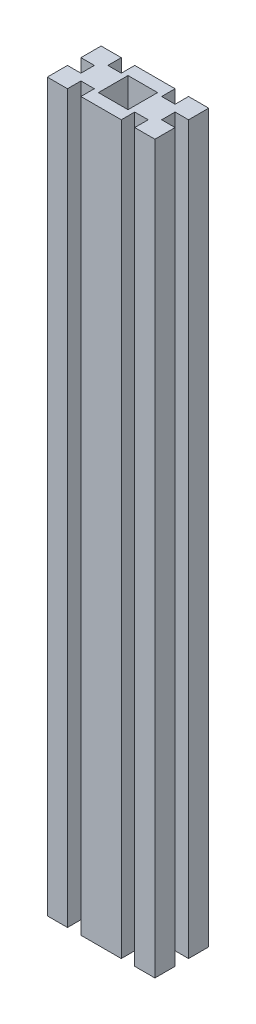
ISO-10303-21;
HEADER;
FILE_DESCRIPTION(('STEP AP214'),'2;1');
FILE_NAME('part.step','',(''),(''),'','','');
FILE_SCHEMA(('AUTOMOTIVE_DESIGN { 1 0 10303 214 1 1 1 1 }'));
ENDSEC;
DATA;
#1=APPLICATION_CONTEXT('core data for automotive mechanical design processes');
#2=APPLICATION_PROTOCOL_DEFINITION('international standard','automotive_design',2000,#1);
#3=PRODUCT_CONTEXT('',#1,'mechanical');
#4=PRODUCT('Part','Part','',(#3));
#5=PRODUCT_RELATED_PRODUCT_CATEGORY('part','',(#4));
#6=PRODUCT_DEFINITION_FORMATION('','',#4);
#7=PRODUCT_DEFINITION_CONTEXT('part definition',#1,'design');
#8=PRODUCT_DEFINITION('design','',#6,#7);
#9=PRODUCT_DEFINITION_SHAPE('','',#8);
#10=(LENGTH_UNIT() NAMED_UNIT(*) SI_UNIT(.MILLI.,.METRE.));
#11=(NAMED_UNIT(*) PLANE_ANGLE_UNIT() SI_UNIT($,.RADIAN.));
#12=(NAMED_UNIT(*) SI_UNIT($,.STERADIAN.) SOLID_ANGLE_UNIT());
#13=UNCERTAINTY_MEASURE_WITH_UNIT(LENGTH_MEASURE(1.E-05),#10,'distance_accuracy_value','');
#14=(GEOMETRIC_REPRESENTATION_CONTEXT(3) GLOBAL_UNCERTAINTY_ASSIGNED_CONTEXT((#13)) GLOBAL_UNIT_ASSIGNED_CONTEXT((#10,
#11,#12)) REPRESENTATION_CONTEXT('',''));
#15=CARTESIAN_POINT('',(0.,0.,0.));
#16=DIRECTION('',(0.,0.,1.));
#17=DIRECTION('',(1.,0.,0.));
#18=AXIS2_PLACEMENT_3D('',#15,#16,#17);
#19=CARTESIAN_POINT('',(-20.,270.,10.));
#20=DIRECTION('',(1.,0.,0.));
#21=DIRECTION('',(0.,0.,-1.));
#22=AXIS2_PLACEMENT_3D('',#19,#20,#21);
#23=PLANE('',#22);
#24=DIRECTION('',(0.,0.,1.));
#25=VECTOR('',#24,1.);
#26=CARTESIAN_POINT('',(-20.,0.,10.));
#27=LINE('',#26,#25);
#28=CARTESIAN_POINT('',(-20.,0.,-10.));
#29=VERTEX_POINT('',#28);
#30=CARTESIAN_POINT('',(-20.,0.,-2.5));
#31=VERTEX_POINT('',#30);
#32=EDGE_CURVE('E316',#29,#31,#27,.T.);
#33=ORIENTED_EDGE('',*,*,#32,.T.);
#34=DIRECTION('',(0.,1.,0.));
#35=VECTOR('',#34,1.);
#36=CARTESIAN_POINT('',(-20.,0.,-2.5));
#37=LINE('',#36,#35);
#38=CARTESIAN_POINT('',(-20.,270.,-2.5));
#39=VERTEX_POINT('',#38);
#40=EDGE_CURVE('E354',#31,#39,#37,.T.);
#41=ORIENTED_EDGE('',*,*,#40,.T.);
#42=DIRECTION('',(0.,0.,1.));
#43=VECTOR('',#42,1.);
#44=CARTESIAN_POINT('',(-20.,270.,10.));
#45=LINE('',#44,#43);
#46=CARTESIAN_POINT('',(-20.,270.,-10.));
#47=VERTEX_POINT('',#46);
#48=EDGE_CURVE('E335',#47,#39,#45,.T.);
#49=ORIENTED_EDGE('',*,*,#48,.F.);
#50=DIRECTION('',(0.,-1.,0.));
#51=VECTOR('',#50,1.);
#52=CARTESIAN_POINT('',(-20.,270.,-10.));
#53=LINE('',#52,#51);
#54=EDGE_CURVE('E279',#47,#29,#53,.T.);
#55=ORIENTED_EDGE('',*,*,#54,.T.);
#56=EDGE_LOOP('',(#33,#41,#49,#55));
#57=FACE_BOUND('',#56,.T.);
#58=ADVANCED_FACE('F33',(#57),#23,.F.);
#59=CARTESIAN_POINT('',(20.,270.,9.99999999999999));
#60=DIRECTION('',(0.,0.,-1.));
#61=DIRECTION('',(-1.,0.,0.));
#62=AXIS2_PLACEMENT_3D('',#59,#60,#61);
#63=PLANE('',#62);
#64=DIRECTION('',(1.,0.,0.));
#65=VECTOR('',#64,1.);
#66=CARTESIAN_POINT('',(20.,0.,9.99999999999999));
#67=LINE('',#66,#65);
#68=CARTESIAN_POINT('',(-20.,0.,10.));
#69=VERTEX_POINT('',#68);
#70=CARTESIAN_POINT('',(-12.5,0.,10.));
#71=VERTEX_POINT('',#70);
#72=EDGE_CURVE('E304',#69,#71,#67,.T.);
#73=ORIENTED_EDGE('',*,*,#72,.T.);
#74=DIRECTION('',(0.,1.,0.));
#75=VECTOR('',#74,1.);
#76=CARTESIAN_POINT('',(-12.5,0.,10.));
#77=LINE('',#76,#75);
#78=CARTESIAN_POINT('',(-12.5,270.,10.));
#79=VERTEX_POINT('',#78);
#80=EDGE_CURVE('E409',#71,#79,#77,.T.);
#81=ORIENTED_EDGE('',*,*,#80,.T.);
#82=DIRECTION('',(1.,0.,0.));
#83=VECTOR('',#82,1.);
#84=CARTESIAN_POINT('',(20.,270.,9.99999999999999));
#85=LINE('',#84,#83);
#86=CARTESIAN_POINT('',(-20.,270.,10.));
#87=VERTEX_POINT('',#86);
#88=EDGE_CURVE('E330',#87,#79,#85,.T.);
#89=ORIENTED_EDGE('',*,*,#88,.F.);
#90=DIRECTION('',(0.,-1.,0.));
#91=VECTOR('',#90,1.);
#92=CARTESIAN_POINT('',(-20.,270.,10.));
#93=LINE('',#92,#91);
#94=EDGE_CURVE('E11',#87,#69,#93,.T.);
#95=ORIENTED_EDGE('',*,*,#94,.T.);
#96=EDGE_LOOP('',(#73,#81,#89,#95));
#97=FACE_BOUND('',#96,.T.);
#98=ADVANCED_FACE('F547',(#97),#63,.F.);
#99=CARTESIAN_POINT('',(-7.5,270.,10.));
#100=VERTEX_POINT('',#99);
#101=CARTESIAN_POINT('',(7.5,270.,10.));
#102=VERTEX_POINT('',#101);
#103=EDGE_CURVE('E333',#100,#102,#85,.T.);
#104=ORIENTED_EDGE('',*,*,#103,.F.);
#105=DIRECTION('',(0.,1.,0.));
#106=VECTOR('',#105,1.);
#107=CARTESIAN_POINT('',(-7.5,0.,10.));
#108=LINE('',#107,#106);
#109=CARTESIAN_POINT('',(-7.5,0.,10.));
#110=VERTEX_POINT('',#109);
#111=EDGE_CURVE('E411',#110,#100,#108,.T.);
#112=ORIENTED_EDGE('',*,*,#111,.F.);
#113=CARTESIAN_POINT('',(7.5,0.,10.));
#114=VERTEX_POINT('',#113);
#115=EDGE_CURVE('E310',#110,#114,#67,.T.);
#116=ORIENTED_EDGE('',*,*,#115,.T.);
#117=DIRECTION('',(0.,1.,0.));
#118=VECTOR('',#117,1.);
#119=CARTESIAN_POINT('',(7.5,0.,10.));
#120=LINE('',#119,#118);
#121=EDGE_CURVE('E391',#114,#102,#120,.T.);
#122=ORIENTED_EDGE('',*,*,#121,.T.);
#123=EDGE_LOOP('',(#104,#112,#116,#122));
#124=FACE_BOUND('',#123,.T.);
#125=ADVANCED_FACE('F535',(#124),#63,.F.);
#126=CARTESIAN_POINT('',(20.,270.,9.99999999999999));
#127=DIRECTION('',(-1.,0.,0.));
#128=DIRECTION('',(0.,0.,1.));
#129=AXIS2_PLACEMENT_3D('',#126,#127,#128);
#130=PLANE('',#129);
#131=DIRECTION('',(0.,0.,-1.));
#132=VECTOR('',#131,1.);
#133=CARTESIAN_POINT('',(20.,270.,9.99999999999999));
#134=LINE('',#133,#132);
#135=CARTESIAN_POINT('',(20.,270.,-2.5));
#136=VERTEX_POINT('',#135);
#137=CARTESIAN_POINT('',(20.,270.,-10.));
#138=VERTEX_POINT('',#137);
#139=EDGE_CURVE('E329',#136,#138,#134,.T.);
#140=ORIENTED_EDGE('',*,*,#139,.F.);
#141=DIRECTION('',(0.,1.,0.));
#142=VECTOR('',#141,1.);
#143=CARTESIAN_POINT('',(20.,0.,-2.5));
#144=LINE('',#143,#142);
#145=CARTESIAN_POINT('',(20.,0.,-2.5));
#146=VERTEX_POINT('',#145);
#147=EDGE_CURVE('E366',#146,#136,#144,.T.);
#148=ORIENTED_EDGE('',*,*,#147,.F.);
#149=DIRECTION('',(0.,0.,-1.));
#150=VECTOR('',#149,1.);
#151=CARTESIAN_POINT('',(20.,0.,9.99999999999999));
#152=LINE('',#151,#150);
#153=CARTESIAN_POINT('',(20.,0.,-10.));
#154=VERTEX_POINT('',#153);
#155=EDGE_CURVE('E303',#146,#154,#152,.T.);
#156=ORIENTED_EDGE('',*,*,#155,.T.);
#157=DIRECTION('',(0.,-1.,0.));
#158=VECTOR('',#157,1.);
#159=CARTESIAN_POINT('',(20.,270.,-10.));
#160=LINE('',#159,#158);
#161=EDGE_CURVE('E282',#138,#154,#160,.T.);
#162=ORIENTED_EDGE('',*,*,#161,.F.);
#163=EDGE_LOOP('',(#140,#148,#156,#162));
#164=FACE_BOUND('',#163,.T.);
#165=ADVANCED_FACE('F516',(#164),#130,.F.);
#166=CARTESIAN_POINT('',(20.,270.,-10.));
#167=DIRECTION('',(0.,0.,1.));
#168=DIRECTION('',(1.,0.,0.));
#169=AXIS2_PLACEMENT_3D('',#166,#167,#168);
#170=PLANE('',#169);
#171=DIRECTION('',(-1.,0.,0.));
#172=VECTOR('',#171,1.);
#173=CARTESIAN_POINT('',(20.,0.,-10.));
#174=LINE('',#173,#172);
#175=CARTESIAN_POINT('',(12.5,0.,-10.));
#176=VERTEX_POINT('',#175);
#177=EDGE_CURVE('E270',#154,#176,#174,.T.);
#178=ORIENTED_EDGE('',*,*,#177,.T.);
#179=DIRECTION('',(0.,1.,0.));
#180=VECTOR('',#179,1.);
#181=CARTESIAN_POINT('',(12.5,0.,-10.));
#182=LINE('',#181,#180);
#183=CARTESIAN_POINT('',(12.5,270.,-10.));
#184=VERTEX_POINT('',#183);
#185=EDGE_CURVE('E378',#176,#184,#182,.T.);
#186=ORIENTED_EDGE('',*,*,#185,.T.);
#187=DIRECTION('',(-1.,0.,0.));
#188=VECTOR('',#187,1.);
#189=CARTESIAN_POINT('',(20.,270.,-10.));
#190=LINE('',#189,#188);
#191=EDGE_CURVE('E283',#138,#184,#190,.T.);
#192=ORIENTED_EDGE('',*,*,#191,.F.);
#193=ORIENTED_EDGE('',*,*,#161,.T.);
#194=EDGE_LOOP('',(#178,#186,#192,#193));
#195=FACE_BOUND('',#194,.T.);
#196=ADVANCED_FACE('F508',(#195),#170,.F.);
#197=CARTESIAN_POINT('',(-12.5,270.,-10.));
#198=VERTEX_POINT('',#197);
#199=EDGE_CURVE('E327',#198,#47,#190,.T.);
#200=ORIENTED_EDGE('',*,*,#199,.F.);
#201=DIRECTION('',(0.,1.,0.));
#202=VECTOR('',#201,1.);
#203=CARTESIAN_POINT('',(-12.5,0.,-10.));
#204=LINE('',#203,#202);
#205=CARTESIAN_POINT('',(-12.5,0.,-10.));
#206=VERTEX_POINT('',#205);
#207=EDGE_CURVE('E323',#206,#198,#204,.T.);
#208=ORIENTED_EDGE('',*,*,#207,.F.);
#209=EDGE_CURVE('E271',#206,#29,#174,.T.);
#210=ORIENTED_EDGE('',*,*,#209,.T.);
#211=ORIENTED_EDGE('',*,*,#54,.F.);
#212=EDGE_LOOP('',(#200,#208,#210,#211));
#213=FACE_BOUND('',#212,.T.);
#214=ADVANCED_FACE('F553',(#213),#170,.F.);
#215=CARTESIAN_POINT('',(-20.,270.,2.5));
#216=VERTEX_POINT('',#215);
#217=EDGE_CURVE('E274',#216,#87,#45,.T.);
#218=ORIENTED_EDGE('',*,*,#217,.F.);
#219=DIRECTION('',(0.,1.,0.));
#220=VECTOR('',#219,1.);
#221=CARTESIAN_POINT('',(-20.,0.,2.5));
#222=LINE('',#221,#220);
#223=CARTESIAN_POINT('',(-20.,0.,2.5));
#224=VERTEX_POINT('',#223);
#225=EDGE_CURVE('E434',#224,#216,#222,.T.);
#226=ORIENTED_EDGE('',*,*,#225,.F.);
#227=EDGE_CURVE('E319',#224,#69,#27,.T.);
#228=ORIENTED_EDGE('',*,*,#227,.T.);
#229=ORIENTED_EDGE('',*,*,#94,.F.);
#230=EDGE_LOOP('',(#218,#226,#228,#229));
#231=FACE_BOUND('',#230,.T.);
#232=ADVANCED_FACE('F35',(#231),#23,.F.);
#233=CARTESIAN_POINT('',(12.5,270.,10.));
#234=VERTEX_POINT('',#233);
#235=CARTESIAN_POINT('',(20.,270.,9.99999999999999));
#236=VERTEX_POINT('',#235);
#237=EDGE_CURVE('E334',#234,#236,#85,.T.);
#238=ORIENTED_EDGE('',*,*,#237,.F.);
#239=DIRECTION('',(0.,1.,0.));
#240=VECTOR('',#239,1.);
#241=CARTESIAN_POINT('',(12.5,0.,10.));
#242=LINE('',#241,#240);
#243=CARTESIAN_POINT('',(12.5,0.,10.));
#244=VERTEX_POINT('',#243);
#245=EDGE_CURVE('E384',#244,#234,#242,.T.);
#246=ORIENTED_EDGE('',*,*,#245,.F.);
#247=CARTESIAN_POINT('',(20.,0.,9.99999999999999));
#248=VERTEX_POINT('',#247);
#249=EDGE_CURVE('E300',#244,#248,#67,.T.);
#250=ORIENTED_EDGE('',*,*,#249,.T.);
#251=DIRECTION('',(0.,-1.,0.));
#252=VECTOR('',#251,1.);
#253=CARTESIAN_POINT('',(20.,270.,9.99999999999999));
#254=LINE('',#253,#252);
#255=EDGE_CURVE('E41',#236,#248,#254,.T.);
#256=ORIENTED_EDGE('',*,*,#255,.F.);
#257=EDGE_LOOP('',(#238,#246,#250,#256));
#258=FACE_BOUND('',#257,.T.);
#259=ADVANCED_FACE('F545',(#258),#63,.F.);
#260=CARTESIAN_POINT('',(20.,0.,2.5));
#261=VERTEX_POINT('',#260);
#262=EDGE_CURVE('E275',#248,#261,#152,.T.);
#263=ORIENTED_EDGE('',*,*,#262,.T.);
#264=DIRECTION('',(0.,1.,0.));
#265=VECTOR('',#264,1.);
#266=CARTESIAN_POINT('',(20.,0.,2.5));
#267=LINE('',#266,#265);
#268=CARTESIAN_POINT('',(20.,270.,2.5));
#269=VERTEX_POINT('',#268);
#270=EDGE_CURVE('E364',#261,#269,#267,.T.);
#271=ORIENTED_EDGE('',*,*,#270,.T.);
#272=EDGE_CURVE('E294',#236,#269,#134,.T.);
#273=ORIENTED_EDGE('',*,*,#272,.F.);
#274=ORIENTED_EDGE('',*,*,#255,.T.);
#275=EDGE_LOOP('',(#263,#271,#273,#274));
#276=FACE_BOUND('',#275,.T.);
#277=ADVANCED_FACE('F291',(#276),#130,.F.);
#278=CARTESIAN_POINT('',(7.5,270.,-10.));
#279=VERTEX_POINT('',#278);
#280=CARTESIAN_POINT('',(-7.5,270.,-10.));
#281=VERTEX_POINT('',#280);
#282=EDGE_CURVE('E262',#279,#281,#190,.T.);
#283=ORIENTED_EDGE('',*,*,#282,.F.);
#284=DIRECTION('',(0.,1.,0.));
#285=VECTOR('',#284,1.);
#286=CARTESIAN_POINT('',(7.5,0.,-10.));
#287=LINE('',#286,#285);
#288=CARTESIAN_POINT('',(7.5,0.,-10.));
#289=VERTEX_POINT('',#288);
#290=EDGE_CURVE('E246',#289,#279,#287,.T.);
#291=ORIENTED_EDGE('',*,*,#290,.F.);
#292=CARTESIAN_POINT('',(-7.5,0.,-10.));
#293=VERTEX_POINT('',#292);
#294=EDGE_CURVE('E260',#289,#293,#174,.T.);
#295=ORIENTED_EDGE('',*,*,#294,.T.);
#296=DIRECTION('',(0.,1.,0.));
#297=VECTOR('',#296,1.);
#298=CARTESIAN_POINT('',(-7.5,0.,-10.));
#299=LINE('',#298,#297);
#300=EDGE_CURVE('E342',#293,#281,#299,.T.);
#301=ORIENTED_EDGE('',*,*,#300,.T.);
#302=EDGE_LOOP('',(#283,#291,#295,#301));
#303=FACE_BOUND('',#302,.T.);
#304=ADVANCED_FACE('F258',(#303),#170,.F.);
#305=CARTESIAN_POINT('',(0.,270.,0.));
#306=DIRECTION('',(0.,1.,0.));
#307=DIRECTION('',(0.,0.,1.));
#308=AXIS2_PLACEMENT_3D('',#305,#306,#307);
#309=PLANE('',#308);
#310=DIRECTION('',(-1.,0.,0.));
#311=VECTOR('',#310,1.);
#312=CARTESIAN_POINT('',(-20.,270.,-2.5));
#313=LINE('',#312,#311);
#314=CARTESIAN_POINT('',(-15.,270.,-2.5));
#315=VERTEX_POINT('',#314);
#316=EDGE_CURVE('E442',#315,#39,#313,.T.);
#317=ORIENTED_EDGE('',*,*,#316,.F.);
#318=DIRECTION('',(0.,0.,-1.));
#319=VECTOR('',#318,1.);
#320=CARTESIAN_POINT('',(-15.,270.,-2.5));
#321=LINE('',#320,#319);
#322=CARTESIAN_POINT('',(-15.,270.,2.5));
#323=VERTEX_POINT('',#322);
#324=EDGE_CURVE('E445',#323,#315,#321,.T.);
#325=ORIENTED_EDGE('',*,*,#324,.F.);
#326=DIRECTION('',(1.,0.,0.));
#327=VECTOR('',#326,1.);
#328=CARTESIAN_POINT('',(-20.,270.,2.5));
#329=LINE('',#328,#327);
#330=EDGE_CURVE('E418',#216,#323,#329,.T.);
#331=ORIENTED_EDGE('',*,*,#330,.F.);
#332=ORIENTED_EDGE('',*,*,#217,.T.);
#333=ORIENTED_EDGE('',*,*,#88,.T.);
#334=DIRECTION('',(0.,0.,1.));
#335=VECTOR('',#334,1.);
#336=CARTESIAN_POINT('',(-12.5,270.,10.));
#337=LINE('',#336,#335);
#338=CARTESIAN_POINT('',(-12.5,270.,5.));
#339=VERTEX_POINT('',#338);
#340=EDGE_CURVE('E394',#339,#79,#337,.T.);
#341=ORIENTED_EDGE('',*,*,#340,.F.);
#342=DIRECTION('',(-1.,0.,0.));
#343=VECTOR('',#342,1.);
#344=CARTESIAN_POINT('',(-12.5,270.,5.));
#345=LINE('',#344,#343);
#346=CARTESIAN_POINT('',(-7.5,270.,5.));
#347=VERTEX_POINT('',#346);
#348=EDGE_CURVE('E419',#347,#339,#345,.T.);
#349=ORIENTED_EDGE('',*,*,#348,.F.);
#350=DIRECTION('',(0.,0.,-1.));
#351=VECTOR('',#350,1.);
#352=CARTESIAN_POINT('',(-7.5,270.,10.));
#353=LINE('',#352,#351);
#354=EDGE_CURVE('E423',#100,#347,#353,.T.);
#355=ORIENTED_EDGE('',*,*,#354,.F.);
#356=ORIENTED_EDGE('',*,*,#103,.T.);
#357=DIRECTION('',(0.,0.,1.));
#358=VECTOR('',#357,1.);
#359=CARTESIAN_POINT('',(7.5,270.,10.));
#360=LINE('',#359,#358);
#361=CARTESIAN_POINT('',(7.5,270.,5.));
#362=VERTEX_POINT('',#361);
#363=EDGE_CURVE('E395',#362,#102,#360,.T.);
#364=ORIENTED_EDGE('',*,*,#363,.F.);
#365=DIRECTION('',(-1.,0.,0.));
#366=VECTOR('',#365,1.);
#367=CARTESIAN_POINT('',(12.5,270.,5.));
#368=LINE('',#367,#366);
#369=CARTESIAN_POINT('',(12.5,270.,5.));
#370=VERTEX_POINT('',#369);
#371=EDGE_CURVE('E398',#370,#362,#368,.T.);
#372=ORIENTED_EDGE('',*,*,#371,.F.);
#373=DIRECTION('',(0.,0.,-1.));
#374=VECTOR('',#373,1.);
#375=CARTESIAN_POINT('',(12.5,270.,10.));
#376=LINE('',#375,#374);
#377=EDGE_CURVE('E368',#234,#370,#376,.T.);
#378=ORIENTED_EDGE('',*,*,#377,.F.);
#379=ORIENTED_EDGE('',*,*,#237,.T.);
#380=ORIENTED_EDGE('',*,*,#272,.T.);
#381=DIRECTION('',(1.,0.,0.));
#382=VECTOR('',#381,1.);
#383=CARTESIAN_POINT('',(20.,270.,2.5));
#384=LINE('',#383,#382);
#385=CARTESIAN_POINT('',(15.,270.,2.5));
#386=VERTEX_POINT('',#385);
#387=EDGE_CURVE('E369',#386,#269,#384,.T.);
#388=ORIENTED_EDGE('',*,*,#387,.F.);
#389=DIRECTION('',(0.,0.,1.));
#390=VECTOR('',#389,1.);
#391=CARTESIAN_POINT('',(15.,270.,-2.5));
#392=LINE('',#391,#390);
#393=CARTESIAN_POINT('',(15.,270.,-2.5));
#394=VERTEX_POINT('',#393);
#395=EDGE_CURVE('E372',#394,#386,#392,.T.);
#396=ORIENTED_EDGE('',*,*,#395,.F.);
#397=DIRECTION('',(-1.,0.,0.));
#398=VECTOR('',#397,1.);
#399=CARTESIAN_POINT('',(20.,270.,-2.5));
#400=LINE('',#399,#398);
#401=EDGE_CURVE('E375',#136,#394,#400,.T.);
#402=ORIENTED_EDGE('',*,*,#401,.F.);
#403=ORIENTED_EDGE('',*,*,#139,.T.);
#404=ORIENTED_EDGE('',*,*,#191,.T.);
#405=DIRECTION('',(0.,0.,-1.));
#406=VECTOR('',#405,1.);
#407=CARTESIAN_POINT('',(12.5,270.,-10.));
#408=LINE('',#407,#406);
#409=CARTESIAN_POINT('',(12.5,270.,-5.00000000000001));
#410=VERTEX_POINT('',#409);
#411=EDGE_CURVE('E253',#410,#184,#408,.T.);
#412=ORIENTED_EDGE('',*,*,#411,.F.);
#413=DIRECTION('',(1.,0.,0.));
#414=VECTOR('',#413,1.);
#415=CARTESIAN_POINT('',(12.5,270.,-5.00000000000001));
#416=LINE('',#415,#414);
#417=CARTESIAN_POINT('',(7.5,270.,-5.00000000000001));
#418=VERTEX_POINT('',#417);
#419=EDGE_CURVE('E492',#418,#410,#416,.T.);
#420=ORIENTED_EDGE('',*,*,#419,.F.);
#421=DIRECTION('',(0.,0.,1.));
#422=VECTOR('',#421,1.);
#423=CARTESIAN_POINT('',(7.5,270.,-10.));
#424=LINE('',#423,#422);
#425=EDGE_CURVE('E464',#279,#418,#424,.T.);
#426=ORIENTED_EDGE('',*,*,#425,.F.);
#427=ORIENTED_EDGE('',*,*,#282,.T.);
#428=DIRECTION('',(0.,0.,-1.));
#429=VECTOR('',#428,1.);
#430=CARTESIAN_POINT('',(-7.5,270.,-10.));
#431=LINE('',#430,#429);
#432=CARTESIAN_POINT('',(-7.5,270.,-5.00000000000001));
#433=VERTEX_POINT('',#432);
#434=EDGE_CURVE('E345',#433,#281,#431,.T.);
#435=ORIENTED_EDGE('',*,*,#434,.F.);
#436=DIRECTION('',(1.,0.,0.));
#437=VECTOR('',#436,1.);
#438=CARTESIAN_POINT('',(-12.5,270.,-5.00000000000001));
#439=LINE('',#438,#437);
#440=CARTESIAN_POINT('',(-12.5,270.,-5.00000000000001));
#441=VERTEX_POINT('',#440);
#442=EDGE_CURVE('E348',#441,#433,#439,.T.);
#443=ORIENTED_EDGE('',*,*,#442,.F.);
#444=DIRECTION('',(0.,0.,1.));
#445=VECTOR('',#444,1.);
#446=CARTESIAN_POINT('',(-12.5,270.,-10.));
#447=LINE('',#446,#445);
#448=EDGE_CURVE('E351',#198,#441,#447,.T.);
#449=ORIENTED_EDGE('',*,*,#448,.F.);
#450=ORIENTED_EDGE('',*,*,#199,.T.);
#451=ORIENTED_EDGE('',*,*,#48,.T.);
#452=EDGE_LOOP('',(#317,#325,#331,#332,#333,#341,#349,#355,#356,#364,#372,#378,#379,#380,#388,
#396,#402,#403,#404,#412,#420,#426,#427,#435,#443,#449,#450,#451));
#453=FACE_BOUND('',#452,.T.);
#454=DIRECTION('',(0.,0.,1.));
#455=VECTOR('',#454,1.);
#456=CARTESIAN_POINT('',(-5.5,270.,-5.5));
#457=LINE('',#456,#455);
#458=CARTESIAN_POINT('',(-5.5,270.,-5.5));
#459=VERTEX_POINT('',#458);
#460=CARTESIAN_POINT('',(-5.5,270.,5.5));
#461=VERTEX_POINT('',#460);
#462=EDGE_CURVE('E48',#459,#461,#457,.T.);
#463=ORIENTED_EDGE('',*,*,#462,.F.);
#464=DIRECTION('',(-1.,0.,0.));
#465=VECTOR('',#464,1.);
#466=CARTESIAN_POINT('',(5.5,270.,-5.5));
#467=LINE('',#466,#465);
#468=CARTESIAN_POINT('',(5.5,270.,-5.5));
#469=VERTEX_POINT('',#468);
#470=EDGE_CURVE('E465',#469,#459,#467,.T.);
#471=ORIENTED_EDGE('',*,*,#470,.F.);
#472=DIRECTION('',(0.,0.,-1.));
#473=VECTOR('',#472,1.);
#474=CARTESIAN_POINT('',(5.5,270.,-5.5));
#475=LINE('',#474,#473);
#476=CARTESIAN_POINT('',(5.5,270.,5.5));
#477=VERTEX_POINT('',#476);
#478=EDGE_CURVE('E469',#477,#469,#475,.T.);
#479=ORIENTED_EDGE('',*,*,#478,.F.);
#480=DIRECTION('',(1.,0.,0.));
#481=VECTOR('',#480,1.);
#482=CARTESIAN_POINT('',(5.5,270.,5.5));
#483=LINE('',#482,#481);
#484=EDGE_CURVE('E472',#461,#477,#483,.T.);
#485=ORIENTED_EDGE('',*,*,#484,.F.);
#486=EDGE_LOOP('',(#463,#471,#479,#485));
#487=FACE_BOUND('',#486,.T.);
#488=ADVANCED_FACE('F511',(#453,#487),#309,.T.);
#489=CARTESIAN_POINT('',(0.,0.,0.));
#490=DIRECTION('',(0.,1.,0.));
#491=DIRECTION('',(0.,0.,1.));
#492=AXIS2_PLACEMENT_3D('',#489,#490,#491);
#493=PLANE('',#492);
#494=DIRECTION('',(0.,0.,-1.));
#495=VECTOR('',#494,1.);
#496=CARTESIAN_POINT('',(-15.,0.,-2.5));
#497=LINE('',#496,#495);
#498=CARTESIAN_POINT('',(-15.,0.,2.5));
#499=VERTEX_POINT('',#498);
#500=CARTESIAN_POINT('',(-15.,0.,-2.5));
#501=VERTEX_POINT('',#500);
#502=EDGE_CURVE('E56',#499,#501,#497,.T.);
#503=ORIENTED_EDGE('',*,*,#502,.T.);
#504=DIRECTION('',(-1.,0.,0.));
#505=VECTOR('',#504,1.);
#506=CARTESIAN_POINT('',(-20.,0.,-2.5));
#507=LINE('',#506,#505);
#508=EDGE_CURVE('E437',#501,#31,#507,.T.);
#509=ORIENTED_EDGE('',*,*,#508,.T.);
#510=ORIENTED_EDGE('',*,*,#32,.F.);
#511=ORIENTED_EDGE('',*,*,#209,.F.);
#512=DIRECTION('',(0.,0.,1.));
#513=VECTOR('',#512,1.);
#514=CARTESIAN_POINT('',(-12.5,0.,-10.));
#515=LINE('',#514,#513);
#516=CARTESIAN_POINT('',(-12.5,0.,-5.00000000000001));
#517=VERTEX_POINT('',#516);
#518=EDGE_CURVE('E347',#206,#517,#515,.T.);
#519=ORIENTED_EDGE('',*,*,#518,.T.);
#520=DIRECTION('',(1.,0.,0.));
#521=VECTOR('',#520,1.);
#522=CARTESIAN_POINT('',(-12.5,0.,-5.00000000000001));
#523=LINE('',#522,#521);
#524=CARTESIAN_POINT('',(-7.5,0.,-5.00000000000001));
#525=VERTEX_POINT('',#524);
#526=EDGE_CURVE('E356',#517,#525,#523,.T.);
#527=ORIENTED_EDGE('',*,*,#526,.T.);
#528=DIRECTION('',(0.,0.,-1.));
#529=VECTOR('',#528,1.);
#530=CARTESIAN_POINT('',(-7.5,0.,-10.));
#531=LINE('',#530,#529);
#532=EDGE_CURVE('E269',#525,#293,#531,.T.);
#533=ORIENTED_EDGE('',*,*,#532,.T.);
#534=ORIENTED_EDGE('',*,*,#294,.F.);
#535=DIRECTION('',(0.,0.,1.));
#536=VECTOR('',#535,1.);
#537=CARTESIAN_POINT('',(7.5,0.,-10.));
#538=LINE('',#537,#536);
#539=CARTESIAN_POINT('',(7.5,0.,-5.00000000000001));
#540=VERTEX_POINT('',#539);
#541=EDGE_CURVE('E242',#289,#540,#538,.T.);
#542=ORIENTED_EDGE('',*,*,#541,.T.);
#543=DIRECTION('',(1.,0.,0.));
#544=VECTOR('',#543,1.);
#545=CARTESIAN_POINT('',(12.5,0.,-5.00000000000001));
#546=LINE('',#545,#544);
#547=CARTESIAN_POINT('',(12.5,0.,-5.00000000000001));
#548=VERTEX_POINT('',#547);
#549=EDGE_CURVE('E252',#540,#548,#546,.T.);
#550=ORIENTED_EDGE('',*,*,#549,.T.);
#551=DIRECTION('',(0.,0.,-1.));
#552=VECTOR('',#551,1.);
#553=CARTESIAN_POINT('',(12.5,0.,-10.));
#554=LINE('',#553,#552);
#555=EDGE_CURVE('E263',#548,#176,#554,.T.);
#556=ORIENTED_EDGE('',*,*,#555,.T.);
#557=ORIENTED_EDGE('',*,*,#177,.F.);
#558=ORIENTED_EDGE('',*,*,#155,.F.);
#559=DIRECTION('',(-1.,0.,0.));
#560=VECTOR('',#559,1.);
#561=CARTESIAN_POINT('',(20.,0.,-2.5));
#562=LINE('',#561,#560);
#563=CARTESIAN_POINT('',(15.,0.,-2.5));
#564=VERTEX_POINT('',#563);
#565=EDGE_CURVE('E371',#146,#564,#562,.T.);
#566=ORIENTED_EDGE('',*,*,#565,.T.);
#567=DIRECTION('',(0.,0.,1.));
#568=VECTOR('',#567,1.);
#569=CARTESIAN_POINT('',(15.,0.,-2.5));
#570=LINE('',#569,#568);
#571=CARTESIAN_POINT('',(15.,0.,2.5));
#572=VERTEX_POINT('',#571);
#573=EDGE_CURVE('E380',#564,#572,#570,.T.);
#574=ORIENTED_EDGE('',*,*,#573,.T.);
#575=DIRECTION('',(1.,0.,0.));
#576=VECTOR('',#575,1.);
#577=CARTESIAN_POINT('',(20.,0.,2.5));
#578=LINE('',#577,#576);
#579=EDGE_CURVE('E302',#572,#261,#578,.T.);
#580=ORIENTED_EDGE('',*,*,#579,.T.);
#581=ORIENTED_EDGE('',*,*,#262,.F.);
#582=ORIENTED_EDGE('',*,*,#249,.F.);
#583=DIRECTION('',(0.,0.,-1.));
#584=VECTOR('',#583,1.);
#585=CARTESIAN_POINT('',(12.5,0.,10.));
#586=LINE('',#585,#584);
#587=CARTESIAN_POINT('',(12.5,0.,5.));
#588=VERTEX_POINT('',#587);
#589=EDGE_CURVE('E397',#244,#588,#586,.T.);
#590=ORIENTED_EDGE('',*,*,#589,.T.);
#591=DIRECTION('',(-1.,0.,0.));
#592=VECTOR('',#591,1.);
#593=CARTESIAN_POINT('',(12.5,0.,5.));
#594=LINE('',#593,#592);
#595=CARTESIAN_POINT('',(7.5,0.,5.));
#596=VERTEX_POINT('',#595);
#597=EDGE_CURVE('E405',#588,#596,#594,.T.);
#598=ORIENTED_EDGE('',*,*,#597,.T.);
#599=DIRECTION('',(0.,0.,1.));
#600=VECTOR('',#599,1.);
#601=CARTESIAN_POINT('',(7.5,0.,10.));
#602=LINE('',#601,#600);
#603=EDGE_CURVE('E387',#596,#114,#602,.T.);
#604=ORIENTED_EDGE('',*,*,#603,.T.);
#605=ORIENTED_EDGE('',*,*,#115,.F.);
#606=DIRECTION('',(0.,0.,-1.));
#607=VECTOR('',#606,1.);
#608=CARTESIAN_POINT('',(-7.5,0.,10.));
#609=LINE('',#608,#607);
#610=CARTESIAN_POINT('',(-7.5,0.,5.));
#611=VERTEX_POINT('',#610);
#612=EDGE_CURVE('E429',#110,#611,#609,.T.);
#613=ORIENTED_EDGE('',*,*,#612,.T.);
#614=DIRECTION('',(-1.,0.,0.));
#615=VECTOR('',#614,1.);
#616=CARTESIAN_POINT('',(-12.5,0.,5.));
#617=LINE('',#616,#615);
#618=CARTESIAN_POINT('',(-12.5,0.,5.));
#619=VERTEX_POINT('',#618);
#620=EDGE_CURVE('E412',#611,#619,#617,.T.);
#621=ORIENTED_EDGE('',*,*,#620,.T.);
#622=DIRECTION('',(0.,0.,1.));
#623=VECTOR('',#622,1.);
#624=CARTESIAN_POINT('',(-12.5,0.,10.));
#625=LINE('',#624,#623);
#626=EDGE_CURVE('E422',#619,#71,#625,.T.);
#627=ORIENTED_EDGE('',*,*,#626,.T.);
#628=ORIENTED_EDGE('',*,*,#72,.F.);
#629=ORIENTED_EDGE('',*,*,#227,.F.);
#630=DIRECTION('',(1.,0.,0.));
#631=VECTOR('',#630,1.);
#632=CARTESIAN_POINT('',(-20.,0.,2.5));
#633=LINE('',#632,#631);
#634=EDGE_CURVE('E444',#224,#499,#633,.T.);
#635=ORIENTED_EDGE('',*,*,#634,.T.);
#636=EDGE_LOOP('',(#503,#509,#510,#511,#519,#527,#533,#534,#542,#550,#556,#557,#558,#566,#574,
#580,#581,#582,#590,#598,#604,#605,#613,#621,#627,#628,#629,#635));
#637=FACE_BOUND('',#636,.T.);
#638=DIRECTION('',(-1.,0.,0.));
#639=VECTOR('',#638,1.);
#640=CARTESIAN_POINT('',(5.5,0.,-5.5));
#641=LINE('',#640,#639);
#642=CARTESIAN_POINT('',(5.5,0.,-5.5));
#643=VERTEX_POINT('',#642);
#644=CARTESIAN_POINT('',(-5.5,0.,-5.5));
#645=VERTEX_POINT('',#644);
#646=EDGE_CURVE('E458',#643,#645,#641,.T.);
#647=ORIENTED_EDGE('',*,*,#646,.T.);
#648=DIRECTION('',(0.,0.,1.));
#649=VECTOR('',#648,1.);
#650=CARTESIAN_POINT('',(-5.5,0.,-5.5));
#651=LINE('',#650,#649);
#652=CARTESIAN_POINT('',(-5.5,0.,5.5));
#653=VERTEX_POINT('',#652);
#654=EDGE_CURVE('E468',#645,#653,#651,.T.);
#655=ORIENTED_EDGE('',*,*,#654,.T.);
#656=DIRECTION('',(1.,0.,0.));
#657=VECTOR('',#656,1.);
#658=CARTESIAN_POINT('',(5.5,0.,5.5));
#659=LINE('',#658,#657);
#660=CARTESIAN_POINT('',(5.5,0.,5.5));
#661=VERTEX_POINT('',#660);
#662=EDGE_CURVE('E481',#653,#661,#659,.T.);
#663=ORIENTED_EDGE('',*,*,#662,.T.);
#664=DIRECTION('',(0.,0.,-1.));
#665=VECTOR('',#664,1.);
#666=CARTESIAN_POINT('',(5.5,0.,-5.5));
#667=LINE('',#666,#665);
#668=EDGE_CURVE('E478',#661,#643,#667,.T.);
#669=ORIENTED_EDGE('',*,*,#668,.T.);
#670=EDGE_LOOP('',(#647,#655,#663,#669));
#671=FACE_BOUND('',#670,.T.);
#672=ADVANCED_FACE('F266',(#637,#671),#493,.F.);
#673=CARTESIAN_POINT('',(-12.5,0.,-10.));
#674=DIRECTION('',(-1.,0.,0.));
#675=DIRECTION('',(0.,0.,1.));
#676=AXIS2_PLACEMENT_3D('',#673,#674,#675);
#677=PLANE('',#676);
#678=ORIENTED_EDGE('',*,*,#448,.T.);
#679=DIRECTION('',(0.,1.,0.));
#680=VECTOR('',#679,1.);
#681=CARTESIAN_POINT('',(-12.5,0.,-5.00000000000001));
#682=LINE('',#681,#680);
#683=EDGE_CURVE('E338',#517,#441,#682,.T.);
#684=ORIENTED_EDGE('',*,*,#683,.F.);
#685=ORIENTED_EDGE('',*,*,#518,.F.);
#686=ORIENTED_EDGE('',*,*,#207,.T.);
#687=EDGE_LOOP('',(#678,#684,#685,#686));
#688=FACE_BOUND('',#687,.T.);
#689=ADVANCED_FACE('F623',(#688),#677,.F.);
#690=CARTESIAN_POINT('',(-7.5,0.,-10.));
#691=DIRECTION('',(1.,0.,0.));
#692=DIRECTION('',(0.,0.,-1.));
#693=AXIS2_PLACEMENT_3D('',#690,#691,#692);
#694=PLANE('',#693);
#695=ORIENTED_EDGE('',*,*,#434,.T.);
#696=ORIENTED_EDGE('',*,*,#300,.F.);
#697=ORIENTED_EDGE('',*,*,#532,.F.);
#698=DIRECTION('',(0.,1.,0.));
#699=VECTOR('',#698,1.);
#700=CARTESIAN_POINT('',(-7.5,0.,-5.00000000000001));
#701=LINE('',#700,#699);
#702=EDGE_CURVE('E340',#525,#433,#701,.T.);
#703=ORIENTED_EDGE('',*,*,#702,.T.);
#704=EDGE_LOOP('',(#695,#696,#697,#703));
#705=FACE_BOUND('',#704,.T.);
#706=ADVANCED_FACE('F632',(#705),#694,.F.);
#707=CARTESIAN_POINT('',(-12.5,0.,-5.00000000000001));
#708=DIRECTION('',(0.,0.,1.));
#709=DIRECTION('',(1.,0.,0.));
#710=AXIS2_PLACEMENT_3D('',#707,#708,#709);
#711=PLANE('',#710);
#712=ORIENTED_EDGE('',*,*,#442,.T.);
#713=ORIENTED_EDGE('',*,*,#702,.F.);
#714=ORIENTED_EDGE('',*,*,#526,.F.);
#715=ORIENTED_EDGE('',*,*,#683,.T.);
#716=EDGE_LOOP('',(#712,#713,#714,#715));
#717=FACE_BOUND('',#716,.T.);
#718=ADVANCED_FACE('F642',(#717),#711,.F.);
#719=CARTESIAN_POINT('',(-5.5,0.,-5.5));
#720=DIRECTION('',(-1.,0.,0.));
#721=DIRECTION('',(0.,0.,1.));
#722=AXIS2_PLACEMENT_3D('',#719,#720,#721);
#723=PLANE('',#722);
#724=ORIENTED_EDGE('',*,*,#462,.T.);
#725=DIRECTION('',(0.,1.,0.));
#726=VECTOR('',#725,1.);
#727=CARTESIAN_POINT('',(-5.5,0.,5.5));
#728=LINE('',#727,#726);
#729=EDGE_CURVE('E455',#653,#461,#728,.T.);
#730=ORIENTED_EDGE('',*,*,#729,.F.);
#731=ORIENTED_EDGE('',*,*,#654,.F.);
#732=DIRECTION('',(0.,1.,0.));
#733=VECTOR('',#732,1.);
#734=CARTESIAN_POINT('',(-5.5,0.,-5.5));
#735=LINE('',#734,#733);
#736=EDGE_CURVE('E462',#645,#459,#735,.T.);
#737=ORIENTED_EDGE('',*,*,#736,.T.);
#738=EDGE_LOOP('',(#724,#730,#731,#737));
#739=FACE_BOUND('',#738,.T.);
#740=ADVANCED_FACE('F652',(#739),#723,.F.);
#741=CARTESIAN_POINT('',(5.5,0.,-5.5));
#742=DIRECTION('',(0.,0.,-1.));
#743=DIRECTION('',(-1.,0.,0.));
#744=AXIS2_PLACEMENT_3D('',#741,#742,#743);
#745=PLANE('',#744);
#746=ORIENTED_EDGE('',*,*,#470,.T.);
#747=ORIENTED_EDGE('',*,*,#736,.F.);
#748=ORIENTED_EDGE('',*,*,#646,.F.);
#749=DIRECTION('',(0.,1.,0.));
#750=VECTOR('',#749,1.);
#751=CARTESIAN_POINT('',(5.5,0.,-5.5));
#752=LINE('',#751,#750);
#753=EDGE_CURVE('E460',#643,#469,#752,.T.);
#754=ORIENTED_EDGE('',*,*,#753,.T.);
#755=EDGE_LOOP('',(#746,#747,#748,#754));
#756=FACE_BOUND('',#755,.T.);
#757=ADVANCED_FACE('F662',(#756),#745,.F.);
#758=CARTESIAN_POINT('',(5.5,0.,-5.5));
#759=DIRECTION('',(1.,0.,0.));
#760=DIRECTION('',(0.,0.,-1.));
#761=AXIS2_PLACEMENT_3D('',#758,#759,#760);
#762=PLANE('',#761);
#763=ORIENTED_EDGE('',*,*,#478,.T.);
#764=ORIENTED_EDGE('',*,*,#753,.F.);
#765=ORIENTED_EDGE('',*,*,#668,.F.);
#766=DIRECTION('',(0.,1.,0.));
#767=VECTOR('',#766,1.);
#768=CARTESIAN_POINT('',(5.5,0.,5.5));
#769=LINE('',#768,#767);
#770=EDGE_CURVE('E457',#661,#477,#769,.T.);
#771=ORIENTED_EDGE('',*,*,#770,.T.);
#772=EDGE_LOOP('',(#763,#764,#765,#771));
#773=FACE_BOUND('',#772,.T.);
#774=ADVANCED_FACE('F671',(#773),#762,.F.);
#775=CARTESIAN_POINT('',(5.5,0.,5.5));
#776=DIRECTION('',(0.,0.,1.));
#777=DIRECTION('',(1.,0.,0.));
#778=AXIS2_PLACEMENT_3D('',#775,#776,#777);
#779=PLANE('',#778);
#780=ORIENTED_EDGE('',*,*,#484,.T.);
#781=ORIENTED_EDGE('',*,*,#770,.F.);
#782=ORIENTED_EDGE('',*,*,#662,.F.);
#783=ORIENTED_EDGE('',*,*,#729,.T.);
#784=EDGE_LOOP('',(#780,#781,#782,#783));
#785=FACE_BOUND('',#784,.T.);
#786=ADVANCED_FACE('F681',(#785),#779,.F.);
#787=CARTESIAN_POINT('',(12.5,0.,-10.));
#788=DIRECTION('',(1.,0.,0.));
#789=DIRECTION('',(0.,0.,-1.));
#790=AXIS2_PLACEMENT_3D('',#787,#788,#789);
#791=PLANE('',#790);
#792=ORIENTED_EDGE('',*,*,#411,.T.);
#793=ORIENTED_EDGE('',*,*,#185,.F.);
#794=ORIENTED_EDGE('',*,*,#555,.F.);
#795=DIRECTION('',(0.,1.,0.));
#796=VECTOR('',#795,1.);
#797=CARTESIAN_POINT('',(12.5,0.,-5.00000000000001));
#798=LINE('',#797,#796);
#799=EDGE_CURVE('E487',#548,#410,#798,.T.);
#800=ORIENTED_EDGE('',*,*,#799,.T.);
#801=EDGE_LOOP('',(#792,#793,#794,#800));
#802=FACE_BOUND('',#801,.T.);
#803=ADVANCED_FACE('F505',(#802),#791,.F.);
#804=CARTESIAN_POINT('',(12.5,0.,-5.00000000000001));
#805=DIRECTION('',(0.,0.,1.));
#806=DIRECTION('',(1.,0.,0.));
#807=AXIS2_PLACEMENT_3D('',#804,#805,#806);
#808=PLANE('',#807);
#809=ORIENTED_EDGE('',*,*,#419,.T.);
#810=ORIENTED_EDGE('',*,*,#799,.F.);
#811=ORIENTED_EDGE('',*,*,#549,.F.);
#812=DIRECTION('',(0.,1.,0.));
#813=VECTOR('',#812,1.);
#814=CARTESIAN_POINT('',(7.5,0.,-5.00000000000001));
#815=LINE('',#814,#813);
#816=EDGE_CURVE('E248',#540,#418,#815,.T.);
#817=ORIENTED_EDGE('',*,*,#816,.T.);
#818=EDGE_LOOP('',(#809,#810,#811,#817));
#819=FACE_BOUND('',#818,.T.);
#820=ADVANCED_FACE('F501',(#819),#808,.F.);
#821=CARTESIAN_POINT('',(7.5,0.,-10.));
#822=DIRECTION('',(-1.,0.,0.));
#823=DIRECTION('',(0.,0.,1.));
#824=AXIS2_PLACEMENT_3D('',#821,#822,#823);
#825=PLANE('',#824);
#826=ORIENTED_EDGE('',*,*,#425,.T.);
#827=ORIENTED_EDGE('',*,*,#816,.F.);
#828=ORIENTED_EDGE('',*,*,#541,.F.);
#829=ORIENTED_EDGE('',*,*,#290,.T.);
#830=EDGE_LOOP('',(#826,#827,#828,#829));
#831=FACE_BOUND('',#830,.T.);
#832=ADVANCED_FACE('F245',(#831),#825,.F.);
#833=CARTESIAN_POINT('',(20.,0.,-2.5));
#834=DIRECTION('',(0.,0.,-1.));
#835=DIRECTION('',(-1.,0.,0.));
#836=AXIS2_PLACEMENT_3D('',#833,#834,#835);
#837=PLANE('',#836);
#838=ORIENTED_EDGE('',*,*,#401,.T.);
#839=DIRECTION('',(0.,1.,0.));
#840=VECTOR('',#839,1.);
#841=CARTESIAN_POINT('',(15.,0.,-2.5));
#842=LINE('',#841,#840);
#843=EDGE_CURVE('E360',#564,#394,#842,.T.);
#844=ORIENTED_EDGE('',*,*,#843,.F.);
#845=ORIENTED_EDGE('',*,*,#565,.F.);
#846=ORIENTED_EDGE('',*,*,#147,.T.);
#847=EDGE_LOOP('',(#838,#844,#845,#846));
#848=FACE_BOUND('',#847,.T.);
#849=ADVANCED_FACE('F519',(#848),#837,.F.);
#850=CARTESIAN_POINT('',(20.,0.,2.5));
#851=DIRECTION('',(0.,0.,1.));
#852=DIRECTION('',(1.,0.,0.));
#853=AXIS2_PLACEMENT_3D('',#850,#851,#852);
#854=PLANE('',#853);
#855=ORIENTED_EDGE('',*,*,#387,.T.);
#856=ORIENTED_EDGE('',*,*,#270,.F.);
#857=ORIENTED_EDGE('',*,*,#579,.F.);
#858=DIRECTION('',(0.,1.,0.));
#859=VECTOR('',#858,1.);
#860=CARTESIAN_POINT('',(15.,0.,2.5));
#861=LINE('',#860,#859);
#862=EDGE_CURVE('E362',#572,#386,#861,.T.);
#863=ORIENTED_EDGE('',*,*,#862,.T.);
#864=EDGE_LOOP('',(#855,#856,#857,#863));
#865=FACE_BOUND('',#864,.T.);
#866=ADVANCED_FACE('F525',(#865),#854,.F.);
#867=CARTESIAN_POINT('',(15.,0.,-2.5));
#868=DIRECTION('',(-1.,0.,0.));
#869=DIRECTION('',(0.,0.,1.));
#870=AXIS2_PLACEMENT_3D('',#867,#868,#869);
#871=PLANE('',#870);
#872=ORIENTED_EDGE('',*,*,#395,.T.);
#873=ORIENTED_EDGE('',*,*,#862,.F.);
#874=ORIENTED_EDGE('',*,*,#573,.F.);
#875=ORIENTED_EDGE('',*,*,#843,.T.);
#876=EDGE_LOOP('',(#872,#873,#874,#875));
#877=FACE_BOUND('',#876,.T.);
#878=ADVANCED_FACE('F522',(#877),#871,.F.);
#879=CARTESIAN_POINT('',(7.5,0.,10.));
#880=DIRECTION('',(-1.,0.,0.));
#881=DIRECTION('',(0.,0.,1.));
#882=AXIS2_PLACEMENT_3D('',#879,#880,#881);
#883=PLANE('',#882);
#884=ORIENTED_EDGE('',*,*,#363,.T.);
#885=ORIENTED_EDGE('',*,*,#121,.F.);
#886=ORIENTED_EDGE('',*,*,#603,.F.);
#887=DIRECTION('',(0.,1.,0.));
#888=VECTOR('',#887,1.);
#889=CARTESIAN_POINT('',(7.5,0.,5.));
#890=LINE('',#889,#888);
#891=EDGE_CURVE('E389',#596,#362,#890,.T.);
#892=ORIENTED_EDGE('',*,*,#891,.T.);
#893=EDGE_LOOP('',(#884,#885,#886,#892));
#894=FACE_BOUND('',#893,.T.);
#895=ADVANCED_FACE('F539',(#894),#883,.F.);
#896=CARTESIAN_POINT('',(12.5,0.,5.));
#897=DIRECTION('',(0.,0.,-1.));
#898=DIRECTION('',(-1.,0.,0.));
#899=AXIS2_PLACEMENT_3D('',#896,#897,#898);
#900=PLANE('',#899);
#901=ORIENTED_EDGE('',*,*,#371,.T.);
#902=ORIENTED_EDGE('',*,*,#891,.F.);
#903=ORIENTED_EDGE('',*,*,#597,.F.);
#904=DIRECTION('',(0.,1.,0.));
#905=VECTOR('',#904,1.);
#906=CARTESIAN_POINT('',(12.5,0.,5.));
#907=LINE('',#906,#905);
#908=EDGE_CURVE('E386',#588,#370,#907,.T.);
#909=ORIENTED_EDGE('',*,*,#908,.T.);
#910=EDGE_LOOP('',(#901,#902,#903,#909));
#911=FACE_BOUND('',#910,.T.);
#912=ADVANCED_FACE('F542',(#911),#900,.F.);
#913=CARTESIAN_POINT('',(12.5,0.,10.));
#914=DIRECTION('',(1.,0.,0.));
#915=DIRECTION('',(0.,0.,-1.));
#916=AXIS2_PLACEMENT_3D('',#913,#914,#915);
#917=PLANE('',#916);
#918=ORIENTED_EDGE('',*,*,#377,.T.);
#919=ORIENTED_EDGE('',*,*,#908,.F.);
#920=ORIENTED_EDGE('',*,*,#589,.F.);
#921=ORIENTED_EDGE('',*,*,#245,.T.);
#922=EDGE_LOOP('',(#918,#919,#920,#921));
#923=FACE_BOUND('',#922,.T.);
#924=ADVANCED_FACE('F544',(#923),#917,.F.);
#925=CARTESIAN_POINT('',(-12.5,0.,10.));
#926=DIRECTION('',(-1.,0.,0.));
#927=DIRECTION('',(0.,0.,1.));
#928=AXIS2_PLACEMENT_3D('',#925,#926,#927);
#929=PLANE('',#928);
#930=ORIENTED_EDGE('',*,*,#340,.T.);
#931=ORIENTED_EDGE('',*,*,#80,.F.);
#932=ORIENTED_EDGE('',*,*,#626,.F.);
#933=DIRECTION('',(0.,1.,0.));
#934=VECTOR('',#933,1.);
#935=CARTESIAN_POINT('',(-12.5,0.,5.));
#936=LINE('',#935,#934);
#937=EDGE_CURVE('E416',#619,#339,#936,.T.);
#938=ORIENTED_EDGE('',*,*,#937,.T.);
#939=EDGE_LOOP('',(#930,#931,#932,#938));
#940=FACE_BOUND('',#939,.T.);
#941=ADVANCED_FACE('F764',(#940),#929,.F.);
#942=CARTESIAN_POINT('',(-12.5,0.,5.));
#943=DIRECTION('',(0.,0.,-1.));
#944=DIRECTION('',(-1.,0.,0.));
#945=AXIS2_PLACEMENT_3D('',#942,#943,#944);
#946=PLANE('',#945);
#947=ORIENTED_EDGE('',*,*,#348,.T.);
#948=ORIENTED_EDGE('',*,*,#937,.F.);
#949=ORIENTED_EDGE('',*,*,#620,.F.);
#950=DIRECTION('',(0.,1.,0.));
#951=VECTOR('',#950,1.);
#952=CARTESIAN_POINT('',(-7.5,0.,5.));
#953=LINE('',#952,#951);
#954=EDGE_CURVE('E414',#611,#347,#953,.T.);
#955=ORIENTED_EDGE('',*,*,#954,.T.);
#956=EDGE_LOOP('',(#947,#948,#949,#955));
#957=FACE_BOUND('',#956,.T.);
#958=ADVANCED_FACE('F773',(#957),#946,.F.);
#959=CARTESIAN_POINT('',(-7.5,0.,10.));
#960=DIRECTION('',(1.,0.,0.));
#961=DIRECTION('',(0.,0.,-1.));
#962=AXIS2_PLACEMENT_3D('',#959,#960,#961);
#963=PLANE('',#962);
#964=ORIENTED_EDGE('',*,*,#354,.T.);
#965=ORIENTED_EDGE('',*,*,#954,.F.);
#966=ORIENTED_EDGE('',*,*,#612,.F.);
#967=ORIENTED_EDGE('',*,*,#111,.T.);
#968=EDGE_LOOP('',(#964,#965,#966,#967));
#969=FACE_BOUND('',#968,.T.);
#970=ADVANCED_FACE('F783',(#969),#963,.F.);
#971=CARTESIAN_POINT('',(-20.,0.,-2.5));
#972=DIRECTION('',(0.,0.,-1.));
#973=DIRECTION('',(-1.,0.,0.));
#974=AXIS2_PLACEMENT_3D('',#971,#972,#973);
#975=PLANE('',#974);
#976=ORIENTED_EDGE('',*,*,#316,.T.);
#977=ORIENTED_EDGE('',*,*,#40,.F.);
#978=ORIENTED_EDGE('',*,*,#508,.F.);
#979=DIRECTION('',(0.,1.,0.));
#980=VECTOR('',#979,1.);
#981=CARTESIAN_POINT('',(-15.,0.,-2.5));
#982=LINE('',#981,#980);
#983=EDGE_CURVE('E439',#501,#315,#982,.T.);
#984=ORIENTED_EDGE('',*,*,#983,.T.);
#985=EDGE_LOOP('',(#976,#977,#978,#984));
#986=FACE_BOUND('',#985,.T.);
#987=ADVANCED_FACE('F793',(#986),#975,.F.);
#988=CARTESIAN_POINT('',(-15.,0.,-2.5));
#989=DIRECTION('',(1.,0.,0.));
#990=DIRECTION('',(0.,0.,-1.));
#991=AXIS2_PLACEMENT_3D('',#988,#989,#990);
#992=PLANE('',#991);
#993=ORIENTED_EDGE('',*,*,#324,.T.);
#994=ORIENTED_EDGE('',*,*,#983,.F.);
#995=ORIENTED_EDGE('',*,*,#502,.F.);
#996=DIRECTION('',(0.,1.,0.));
#997=VECTOR('',#996,1.);
#998=CARTESIAN_POINT('',(-15.,0.,2.5));
#999=LINE('',#998,#997);
#1000=EDGE_CURVE('E436',#499,#323,#999,.T.);
#1001=ORIENTED_EDGE('',*,*,#1000,.T.);
#1002=EDGE_LOOP('',(#993,#994,#995,#1001));
#1003=FACE_BOUND('',#1002,.T.);
#1004=ADVANCED_FACE('F803',(#1003),#992,.F.);
#1005=CARTESIAN_POINT('',(-20.,0.,2.5));
#1006=DIRECTION('',(0.,0.,1.));
#1007=DIRECTION('',(1.,0.,0.));
#1008=AXIS2_PLACEMENT_3D('',#1005,#1006,#1007);
#1009=PLANE('',#1008);
#1010=ORIENTED_EDGE('',*,*,#330,.T.);
#1011=ORIENTED_EDGE('',*,*,#1000,.F.);
#1012=ORIENTED_EDGE('',*,*,#634,.F.);
#1013=ORIENTED_EDGE('',*,*,#225,.T.);
#1014=EDGE_LOOP('',(#1010,#1011,#1012,#1013));
#1015=FACE_BOUND('',#1014,.T.);
#1016=ADVANCED_FACE('F813',(#1015),#1009,.F.);
#1017=CLOSED_SHELL('',(#58,#98,#125,#165,#196,#214,#232,#259,#277,#304,#488,#672,#689,#706,#718,
#740,#757,#774,#786,#803,#820,#832,#849,#866,#878,#895,#912,#924,#941,#958,#970,#987,#1004,#1016));
#1018=MANIFOLD_SOLID_BREP('B2',#1017);
#1019=ADVANCED_BREP_SHAPE_REPRESENTATION('',(#18,#1018),#14);
#1020=SHAPE_DEFINITION_REPRESENTATION(#9,#1019);
ENDSEC;
END-ISO-10303-21;
